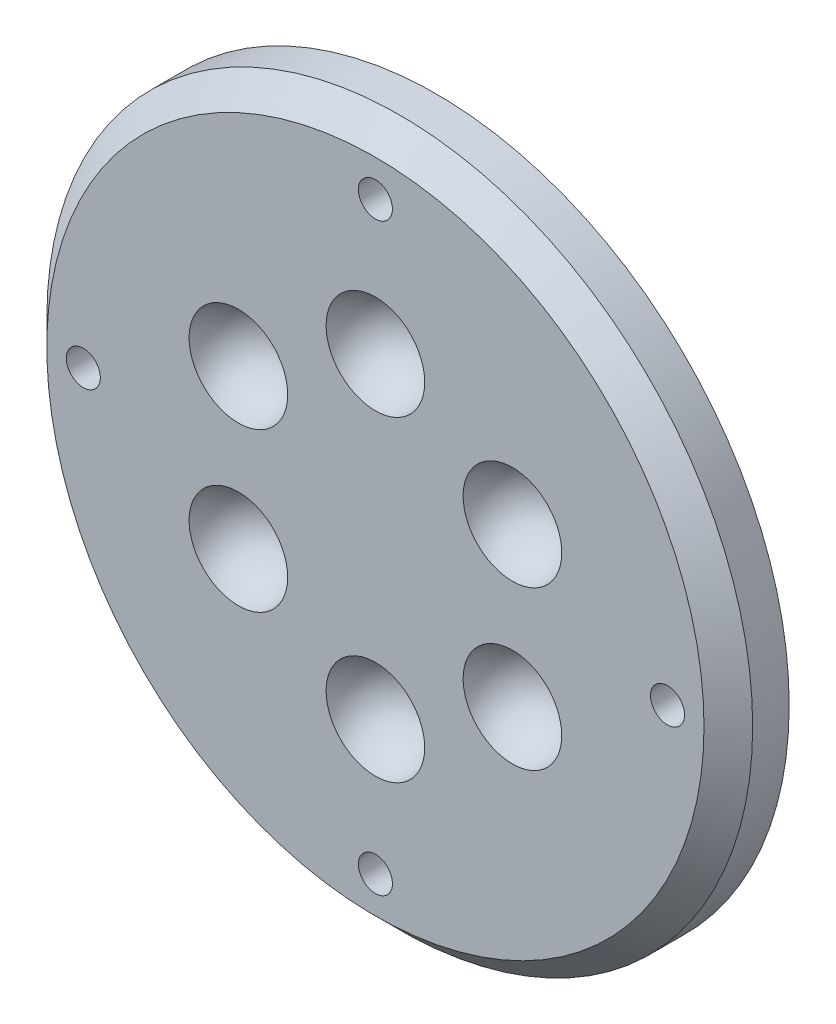
ISO-10303-21;
HEADER;
FILE_DESCRIPTION(('STEP AP214'),'2;1');
FILE_NAME('part.step','',(''),(''),'','','');
FILE_SCHEMA(('AUTOMOTIVE_DESIGN { 1 0 10303 214 1 1 1 1 }'));
ENDSEC;
DATA;
#1=APPLICATION_CONTEXT('core data for automotive mechanical design processes');
#2=APPLICATION_PROTOCOL_DEFINITION('international standard','automotive_design',2000,#1);
#3=PRODUCT_CONTEXT('',#1,'mechanical');
#4=PRODUCT('Part','Part','',(#3));
#5=PRODUCT_RELATED_PRODUCT_CATEGORY('part','',(#4));
#6=PRODUCT_DEFINITION_FORMATION('','',#4);
#7=PRODUCT_DEFINITION_CONTEXT('part definition',#1,'design');
#8=PRODUCT_DEFINITION('design','',#6,#7);
#9=PRODUCT_DEFINITION_SHAPE('','',#8);
#10=(LENGTH_UNIT() NAMED_UNIT(*) SI_UNIT(.MILLI.,.METRE.));
#11=(NAMED_UNIT(*) PLANE_ANGLE_UNIT() SI_UNIT($,.RADIAN.));
#12=(NAMED_UNIT(*) SI_UNIT($,.STERADIAN.) SOLID_ANGLE_UNIT());
#13=UNCERTAINTY_MEASURE_WITH_UNIT(LENGTH_MEASURE(1.E-05),#10,'distance_accuracy_value','');
#14=(GEOMETRIC_REPRESENTATION_CONTEXT(3) GLOBAL_UNCERTAINTY_ASSIGNED_CONTEXT((#13)) GLOBAL_UNIT_ASSIGNED_CONTEXT((#10,
#11,#12)) REPRESENTATION_CONTEXT('',''));
#15=CARTESIAN_POINT('',(0.,0.,0.));
#16=DIRECTION('',(0.,0.,1.));
#17=DIRECTION('',(1.,0.,0.));
#18=AXIS2_PLACEMENT_3D('',#15,#16,#17);
#19=CARTESIAN_POINT('',(0.,0.,3.175));
#20=DIRECTION('',(0.,0.,1.));
#21=DIRECTION('',(1.,0.,0.));
#22=AXIS2_PLACEMENT_3D('',#19,#20,#21);
#23=PLANE('',#22);
#24=CARTESIAN_POINT('',(0.,0.,3.175));
#25=DIRECTION('',(0.,0.,1.));
#26=DIRECTION('',(1.,0.,0.));
#27=AXIS2_PLACEMENT_3D('',#24,#25,#26);
#28=CIRCLE('',#27,17.145);
#29=CARTESIAN_POINT('',(17.145,0.,3.175));
#30=VERTEX_POINT('',#29);
#31=EDGE_CURVE('E42',#30,#30,#28,.T.);
#32=ORIENTED_EDGE('',*,*,#31,.T.);
#33=EDGE_LOOP('',(#32));
#34=FACE_BOUND('',#33,.T.);
#35=CARTESIAN_POINT('',(0.,15.24,3.175));
#36=DIRECTION('',(0.,0.,-1.));
#37=DIRECTION('',(-1.,0.,0.));
#38=AXIS2_PLACEMENT_3D('',#35,#36,#37);
#39=CIRCLE('',#38,0.888999999999999);
#40=CARTESIAN_POINT('',(-0.888999999999999,15.24,3.175));
#41=VERTEX_POINT('',#40);
#42=EDGE_CURVE('E88',#41,#41,#39,.T.);
#43=ORIENTED_EDGE('',*,*,#42,.T.);
#44=EDGE_LOOP('',(#43));
#45=FACE_BOUND('',#44,.T.);
#46=CARTESIAN_POINT('',(-15.24,0.,3.175));
#47=DIRECTION('',(0.,0.,-1.));
#48=DIRECTION('',(-1.,0.,0.));
#49=AXIS2_PLACEMENT_3D('',#46,#47,#48);
#50=CIRCLE('',#49,0.888999999999999);
#51=CARTESIAN_POINT('',(-16.129,0.,3.175));
#52=VERTEX_POINT('',#51);
#53=EDGE_CURVE('E82',#52,#52,#50,.T.);
#54=ORIENTED_EDGE('',*,*,#53,.T.);
#55=EDGE_LOOP('',(#54));
#56=FACE_BOUND('',#55,.T.);
#57=CARTESIAN_POINT('',(1.06420351207939E-13,-15.24,3.175));
#58=DIRECTION('',(0.,0.,-1.));
#59=DIRECTION('',(-1.,0.,0.));
#60=AXIS2_PLACEMENT_3D('',#57,#58,#59);
#61=CIRCLE('',#60,0.888999999999999);
#62=CARTESIAN_POINT('',(-0.888999999999892,-15.24,3.175));
#63=VERTEX_POINT('',#62);
#64=EDGE_CURVE('E76',#63,#63,#61,.T.);
#65=ORIENTED_EDGE('',*,*,#64,.T.);
#66=EDGE_LOOP('',(#65));
#67=FACE_BOUND('',#66,.T.);
#68=CARTESIAN_POINT('',(15.24,1.59630526811908E-13,3.175));
#69=DIRECTION('',(0.,0.,-1.));
#70=DIRECTION('',(-1.,0.,0.));
#71=AXIS2_PLACEMENT_3D('',#68,#69,#70);
#72=CIRCLE('',#71,0.888999999999999);
#73=CARTESIAN_POINT('',(14.351,1.59630526811908E-13,3.175));
#74=VERTEX_POINT('',#73);
#75=EDGE_CURVE('E57',#74,#74,#72,.T.);
#76=ORIENTED_EDGE('',*,*,#75,.T.);
#77=EDGE_LOOP('',(#76));
#78=FACE_BOUND('',#77,.T.);
#79=CARTESIAN_POINT('',(-7.14903970824058,-4.12749999999993,3.175));
#80=DIRECTION('',(0.,0.,1.));
#81=DIRECTION('',(1.,0.,0.));
#82=AXIS2_PLACEMENT_3D('',#79,#80,#81);
#83=CIRCLE('',#82,2.57193814126623);
#84=CARTESIAN_POINT('',(-4.57710156697435,-4.12749999999993,3.175));
#85=VERTEX_POINT('',#84);
#86=EDGE_CURVE('E56',#85,#85,#83,.F.);
#87=ORIENTED_EDGE('',*,*,#86,.T.);
#88=EDGE_LOOP('',(#87));
#89=FACE_BOUND('',#88,.T.);
#90=CARTESIAN_POINT('',(7.14903970824052,-4.12750000000003,3.175));
#91=DIRECTION('',(0.,0.,1.));
#92=DIRECTION('',(1.,0.,0.));
#93=AXIS2_PLACEMENT_3D('',#90,#91,#92);
#94=CIRCLE('',#93,2.57193814126623);
#95=CARTESIAN_POINT('',(9.72097784950676,-4.12750000000003,3.175));
#96=VERTEX_POINT('',#95);
#97=EDGE_CURVE('E63',#96,#96,#94,.F.);
#98=ORIENTED_EDGE('',*,*,#97,.T.);
#99=EDGE_LOOP('',(#98));
#100=FACE_BOUND('',#99,.T.);
#101=CARTESIAN_POINT('',(0.,8.255,3.175));
#102=DIRECTION('',(0.,0.,1.));
#103=DIRECTION('',(1.,0.,0.));
#104=AXIS2_PLACEMENT_3D('',#101,#102,#103);
#105=CIRCLE('',#104,2.57193814126623);
#106=CARTESIAN_POINT('',(2.57193814126623,8.255,3.175));
#107=VERTEX_POINT('',#106);
#108=EDGE_CURVE('E50',#107,#107,#105,.F.);
#109=ORIENTED_EDGE('',*,*,#108,.T.);
#110=EDGE_LOOP('',(#109));
#111=FACE_BOUND('',#110,.T.);
#112=CARTESIAN_POINT('',(7.14903970824055,4.12749999999998,3.175));
#113=DIRECTION('',(0.,0.,1.));
#114=DIRECTION('',(1.,0.,0.));
#115=AXIS2_PLACEMENT_3D('',#112,#113,#114);
#116=CIRCLE('',#115,2.57193814126623);
#117=CARTESIAN_POINT('',(9.72097784950678,4.12749999999998,3.175));
#118=VERTEX_POINT('',#117);
#119=EDGE_CURVE('E66',#118,#118,#116,.F.);
#120=ORIENTED_EDGE('',*,*,#119,.T.);
#121=EDGE_LOOP('',(#120));
#122=FACE_BOUND('',#121,.T.);
#123=CARTESIAN_POINT('',(0.,-8.255,3.175));
#124=DIRECTION('',(0.,0.,1.));
#125=DIRECTION('',(1.,0.,0.));
#126=AXIS2_PLACEMENT_3D('',#123,#124,#125);
#127=CIRCLE('',#126,2.57193814126623);
#128=CARTESIAN_POINT('',(2.57193814126623,-8.255,3.175));
#129=VERTEX_POINT('',#128);
#130=EDGE_CURVE('E60',#129,#129,#127,.F.);
#131=ORIENTED_EDGE('',*,*,#130,.T.);
#132=EDGE_LOOP('',(#131));
#133=FACE_BOUND('',#132,.T.);
#134=CARTESIAN_POINT('',(-7.14903970824049,4.12750000000008,3.175));
#135=DIRECTION('',(0.,0.,1.));
#136=DIRECTION('',(1.,0.,0.));
#137=AXIS2_PLACEMENT_3D('',#134,#135,#136);
#138=CIRCLE('',#137,2.57193814126623);
#139=CARTESIAN_POINT('',(-4.57710156697426,4.12750000000008,3.175));
#140=VERTEX_POINT('',#139);
#141=EDGE_CURVE('E53',#140,#140,#138,.F.);
#142=ORIENTED_EDGE('',*,*,#141,.T.);
#143=EDGE_LOOP('',(#142));
#144=FACE_BOUND('',#143,.T.);
#145=ADVANCED_FACE('F35',(#34,#45,#56,#67,#78,#89,#100,#111,#122,#133,#144),#23,.T.);
#146=CARTESIAN_POINT('',(0.,0.,3.175));
#147=DIRECTION('',(0.,0.,-1.));
#148=DIRECTION('',(-1.,0.,0.));
#149=AXIS2_PLACEMENT_3D('',#146,#147,#148);
#150=CYLINDRICAL_SURFACE('',#149,18.415);
#151=CARTESIAN_POINT('',(0.,0.,1.90500000000001));
#152=DIRECTION('',(0.,0.,1.));
#153=DIRECTION('',(1.,0.,0.));
#154=AXIS2_PLACEMENT_3D('',#151,#152,#153);
#155=CIRCLE('',#154,18.415);
#156=CARTESIAN_POINT('',(18.415,0.,1.90500000000001));
#157=VERTEX_POINT('',#156);
#158=EDGE_CURVE('E10',#157,#157,#155,.F.);
#159=ORIENTED_EDGE('',*,*,#158,.T.);
#160=EDGE_LOOP('',(#159));
#161=FACE_BOUND('',#160,.T.);
#162=CARTESIAN_POINT('',(0.,0.,0.));
#163=DIRECTION('',(0.,0.,1.));
#164=DIRECTION('',(1.,0.,0.));
#165=AXIS2_PLACEMENT_3D('',#162,#163,#164);
#166=CIRCLE('',#165,18.415);
#167=CARTESIAN_POINT('',(18.415,0.,0.));
#168=VERTEX_POINT('',#167);
#169=EDGE_CURVE('E46',#168,#168,#166,.T.);
#170=ORIENTED_EDGE('',*,*,#169,.T.);
#171=EDGE_LOOP('',(#170));
#172=FACE_BOUND('',#171,.T.);
#173=ADVANCED_FACE('F101',(#161,#172),#150,.T.);
#174=CARTESIAN_POINT('',(0.,0.,0.));
#175=DIRECTION('',(0.,0.,1.));
#176=DIRECTION('',(1.,0.,0.));
#177=AXIS2_PLACEMENT_3D('',#174,#175,#176);
#178=PLANE('',#177);
#179=CARTESIAN_POINT('',(0.,15.24,0.));
#180=DIRECTION('',(0.,0.,-1.));
#181=DIRECTION('',(-1.,0.,0.));
#182=AXIS2_PLACEMENT_3D('',#179,#180,#181);
#183=CIRCLE('',#182,0.888999999999987);
#184=CARTESIAN_POINT('',(-0.888999999999987,15.24,0.));
#185=VERTEX_POINT('',#184);
#186=EDGE_CURVE('E91',#185,#185,#183,.T.);
#187=ORIENTED_EDGE('',*,*,#186,.F.);
#188=EDGE_LOOP('',(#187));
#189=FACE_BOUND('',#188,.T.);
#190=CARTESIAN_POINT('',(-15.24,0.,0.));
#191=DIRECTION('',(0.,0.,-1.));
#192=DIRECTION('',(-1.,0.,0.));
#193=AXIS2_PLACEMENT_3D('',#190,#191,#192);
#194=CIRCLE('',#193,0.888999999999987);
#195=CARTESIAN_POINT('',(-16.129,0.,0.));
#196=VERTEX_POINT('',#195);
#197=EDGE_CURVE('E85',#196,#196,#194,.T.);
#198=ORIENTED_EDGE('',*,*,#197,.F.);
#199=EDGE_LOOP('',(#198));
#200=FACE_BOUND('',#199,.T.);
#201=CARTESIAN_POINT('',(1.06420351207939E-13,-15.24,0.));
#202=DIRECTION('',(0.,0.,-1.));
#203=DIRECTION('',(-1.,0.,0.));
#204=AXIS2_PLACEMENT_3D('',#201,#202,#203);
#205=CIRCLE('',#204,0.888999999999987);
#206=CARTESIAN_POINT('',(-0.888999999999881,-15.24,0.));
#207=VERTEX_POINT('',#206);
#208=EDGE_CURVE('E79',#207,#207,#205,.T.);
#209=ORIENTED_EDGE('',*,*,#208,.F.);
#210=EDGE_LOOP('',(#209));
#211=FACE_BOUND('',#210,.T.);
#212=CARTESIAN_POINT('',(15.24,1.59630526811908E-13,0.));
#213=DIRECTION('',(0.,0.,-1.));
#214=DIRECTION('',(-1.,0.,0.));
#215=AXIS2_PLACEMENT_3D('',#212,#213,#214);
#216=CIRCLE('',#215,0.888999999999985);
#217=CARTESIAN_POINT('',(14.351,1.59630526811908E-13,0.));
#218=VERTEX_POINT('',#217);
#219=EDGE_CURVE('E73',#218,#218,#216,.T.);
#220=ORIENTED_EDGE('',*,*,#219,.F.);
#221=EDGE_LOOP('',(#220));
#222=FACE_BOUND('',#221,.T.);
#223=ORIENTED_EDGE('',*,*,#169,.F.);
#224=EDGE_LOOP('',(#223));
#225=FACE_BOUND('',#224,.T.);
#226=ADVANCED_FACE('F97',(#189,#200,#211,#222,#225),#178,.F.);
#227=CARTESIAN_POINT('',(0.,8.255,3.429));
#228=DIRECTION('',(0.,0.,1.));
#229=DIRECTION('',(0.,1.,0.));
#230=AXIS2_PLACEMENT_3D('',#227,#228,#229);
#231=SPHERICAL_SURFACE('',#230,2.58445);
#232=ORIENTED_EDGE('',*,*,#108,.F.);
#233=EDGE_LOOP('',(#232));
#234=FACE_BOUND('',#233,.T.);
#235=ADVANCED_FACE('F100',(#234),#231,.F.);
#236=CARTESIAN_POINT('',(7.14903970824055,4.12749999999998,3.429));
#237=DIRECTION('',(0.,0.,1.));
#238=DIRECTION('',(0.86602540378444,0.499999999999998,0.));
#239=AXIS2_PLACEMENT_3D('',#236,#237,#238);
#240=SPHERICAL_SURFACE('',#239,2.58445);
#241=ORIENTED_EDGE('',*,*,#119,.F.);
#242=EDGE_LOOP('',(#241));
#243=FACE_BOUND('',#242,.T.);
#244=ADVANCED_FACE('F119',(#243),#240,.F.);
#245=CARTESIAN_POINT('',(7.14903970824052,-4.12750000000003,3.429));
#246=DIRECTION('',(0.,0.,1.));
#247=DIRECTION('',(0.866025403784436,-0.500000000000004,0.));
#248=AXIS2_PLACEMENT_3D('',#245,#246,#247);
#249=SPHERICAL_SURFACE('',#248,2.58445);
#250=ORIENTED_EDGE('',*,*,#97,.F.);
#251=EDGE_LOOP('',(#250));
#252=FACE_BOUND('',#251,.T.);
#253=ADVANCED_FACE('F123',(#252),#249,.F.);
#254=CARTESIAN_POINT('',(0.,-8.255,3.429));
#255=DIRECTION('',(0.,0.,1.));
#256=DIRECTION('',(0.,-1.,0.));
#257=AXIS2_PLACEMENT_3D('',#254,#255,#256);
#258=SPHERICAL_SURFACE('',#257,2.58445);
#259=ORIENTED_EDGE('',*,*,#130,.F.);
#260=EDGE_LOOP('',(#259));
#261=FACE_BOUND('',#260,.T.);
#262=ADVANCED_FACE('F127',(#261),#258,.F.);
#263=CARTESIAN_POINT('',(-7.14903970824058,-4.12749999999993,3.429));
#264=DIRECTION('',(0.,0.,1.));
#265=DIRECTION('',(-0.866025403784443,-0.499999999999992,0.));
#266=AXIS2_PLACEMENT_3D('',#263,#264,#265);
#267=SPHERICAL_SURFACE('',#266,2.58445);
#268=ORIENTED_EDGE('',*,*,#86,.F.);
#269=EDGE_LOOP('',(#268));
#270=FACE_BOUND('',#269,.T.);
#271=ADVANCED_FACE('F131',(#270),#267,.F.);
#272=CARTESIAN_POINT('',(-7.14903970824049,4.12750000000008,3.429));
#273=DIRECTION('',(0.,0.,1.));
#274=DIRECTION('',(-0.866025403784433,0.50000000000001,0.));
#275=AXIS2_PLACEMENT_3D('',#272,#273,#274);
#276=SPHERICAL_SURFACE('',#275,2.58445);
#277=ORIENTED_EDGE('',*,*,#141,.F.);
#278=EDGE_LOOP('',(#277));
#279=FACE_BOUND('',#278,.T.);
#280=ADVANCED_FACE('F135',(#279),#276,.F.);
#281=CARTESIAN_POINT('',(15.24,1.59630526811908E-13,0.));
#282=DIRECTION('',(0.,0.,-1.));
#283=DIRECTION('',(-1.,0.,0.));
#284=AXIS2_PLACEMENT_3D('',#281,#282,#283);
#285=CYLINDRICAL_SURFACE('',#284,0.888999999999992);
#286=ORIENTED_EDGE('',*,*,#75,.F.);
#287=EDGE_LOOP('',(#286));
#288=FACE_BOUND('',#287,.T.);
#289=ORIENTED_EDGE('',*,*,#219,.T.);
#290=EDGE_LOOP('',(#289));
#291=FACE_BOUND('',#290,.T.);
#292=ADVANCED_FACE('F139',(#288,#291),#285,.F.);
#293=CARTESIAN_POINT('',(1.06420351207939E-13,-15.24,0.));
#294=DIRECTION('',(0.,0.,-1.));
#295=DIRECTION('',(-1.,0.,0.));
#296=AXIS2_PLACEMENT_3D('',#293,#294,#295);
#297=CYLINDRICAL_SURFACE('',#296,0.888999999999993);
#298=ORIENTED_EDGE('',*,*,#64,.F.);
#299=EDGE_LOOP('',(#298));
#300=FACE_BOUND('',#299,.T.);
#301=ORIENTED_EDGE('',*,*,#208,.T.);
#302=EDGE_LOOP('',(#301));
#303=FACE_BOUND('',#302,.T.);
#304=ADVANCED_FACE('F143',(#300,#303),#297,.F.);
#305=CARTESIAN_POINT('',(-15.24,0.,0.));
#306=DIRECTION('',(0.,0.,-1.));
#307=DIRECTION('',(-1.,0.,0.));
#308=AXIS2_PLACEMENT_3D('',#305,#306,#307);
#309=CYLINDRICAL_SURFACE('',#308,0.888999999999993);
#310=ORIENTED_EDGE('',*,*,#53,.F.);
#311=EDGE_LOOP('',(#310));
#312=FACE_BOUND('',#311,.T.);
#313=ORIENTED_EDGE('',*,*,#197,.T.);
#314=EDGE_LOOP('',(#313));
#315=FACE_BOUND('',#314,.T.);
#316=ADVANCED_FACE('F147',(#312,#315),#309,.F.);
#317=CARTESIAN_POINT('',(0.,15.24,0.));
#318=DIRECTION('',(0.,0.,-1.));
#319=DIRECTION('',(-1.,0.,0.));
#320=AXIS2_PLACEMENT_3D('',#317,#318,#319);
#321=CYLINDRICAL_SURFACE('',#320,0.888999999999993);
#322=ORIENTED_EDGE('',*,*,#42,.F.);
#323=EDGE_LOOP('',(#322));
#324=FACE_BOUND('',#323,.T.);
#325=ORIENTED_EDGE('',*,*,#186,.T.);
#326=EDGE_LOOP('',(#325));
#327=FACE_BOUND('',#326,.T.);
#328=ADVANCED_FACE('F95',(#324,#327),#321,.F.);
#329=CARTESIAN_POINT('',(0.,0.,3.175));
#330=DIRECTION('',(0.,0.,-1.));
#331=DIRECTION('',(-1.,0.,0.));
#332=AXIS2_PLACEMENT_3D('',#329,#330,#331);
#333=CONICAL_SURFACE('',#332,17.145,0.785398163397446);
#334=ORIENTED_EDGE('',*,*,#158,.F.);
#335=EDGE_LOOP('',(#334));
#336=FACE_BOUND('',#335,.T.);
#337=ORIENTED_EDGE('',*,*,#31,.F.);
#338=EDGE_LOOP('',(#337));
#339=FACE_BOUND('',#338,.T.);
#340=ADVANCED_FACE('F37',(#336,#339),#333,.T.);
#341=CLOSED_SHELL('',(#145,#173,#226,#235,#244,#253,#262,#271,#280,#292,#304,#316,#328,#340));
#342=MANIFOLD_SOLID_BREP('B2',#341);
#343=ADVANCED_BREP_SHAPE_REPRESENTATION('',(#18,#342),#14);
#344=SHAPE_DEFINITION_REPRESENTATION(#9,#343);
ENDSEC;
END-ISO-10303-21;
